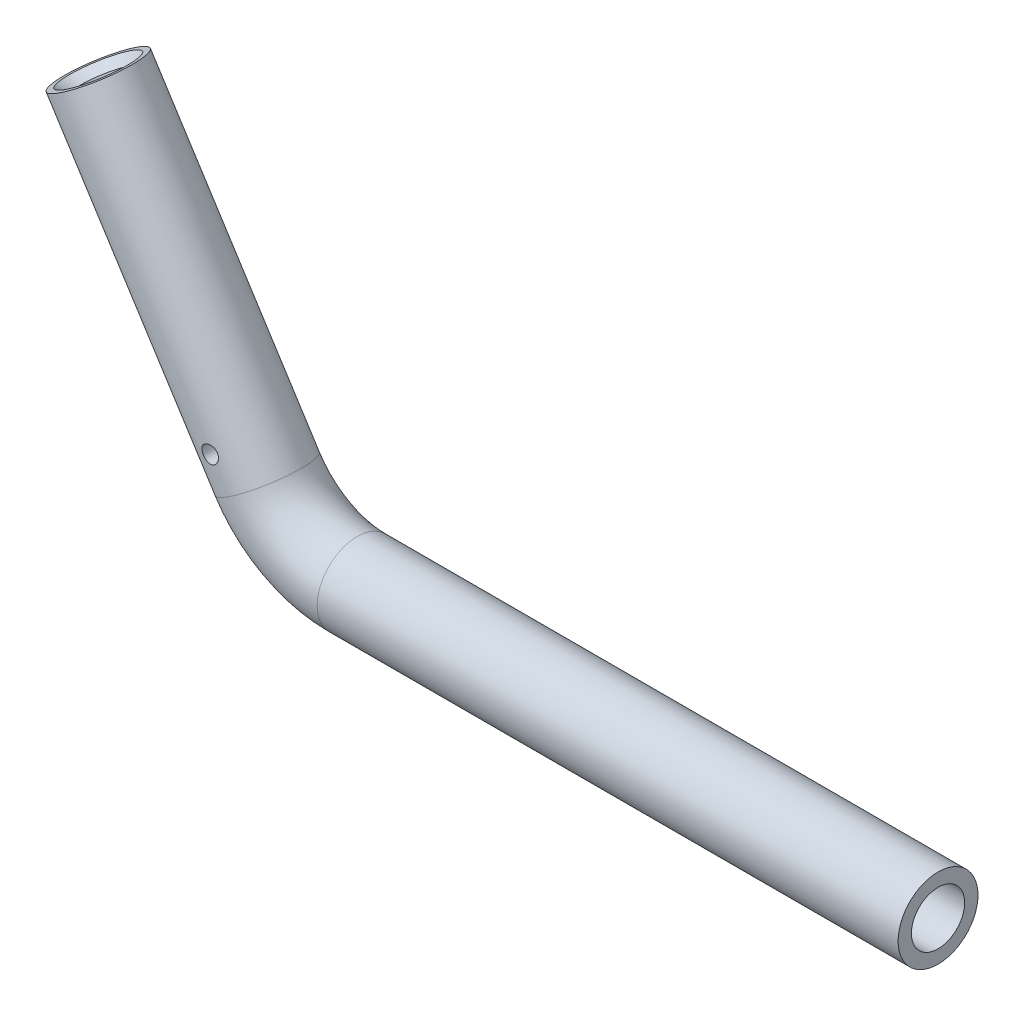
ISO-10303-21;
HEADER;
FILE_DESCRIPTION(('STEP AP214'),'2;1');
FILE_NAME('part.step','',(''),(''),'','','');
FILE_SCHEMA(('AUTOMOTIVE_DESIGN { 1 0 10303 214 1 1 1 1 }'));
ENDSEC;
DATA;
#1=APPLICATION_CONTEXT('core data for automotive mechanical design processes');
#2=APPLICATION_PROTOCOL_DEFINITION('international standard','automotive_design',2000,#1);
#3=PRODUCT_CONTEXT('',#1,'mechanical');
#4=PRODUCT('Part','Part','',(#3));
#5=PRODUCT_RELATED_PRODUCT_CATEGORY('part','',(#4));
#6=PRODUCT_DEFINITION_FORMATION('','',#4);
#7=PRODUCT_DEFINITION_CONTEXT('part definition',#1,'design');
#8=PRODUCT_DEFINITION('design','',#6,#7);
#9=PRODUCT_DEFINITION_SHAPE('','',#8);
#10=(LENGTH_UNIT() NAMED_UNIT(*) SI_UNIT(.MILLI.,.METRE.));
#11=(NAMED_UNIT(*) PLANE_ANGLE_UNIT() SI_UNIT($,.RADIAN.));
#12=(NAMED_UNIT(*) SI_UNIT($,.STERADIAN.) SOLID_ANGLE_UNIT());
#13=UNCERTAINTY_MEASURE_WITH_UNIT(LENGTH_MEASURE(1.E-05),#10,'distance_accuracy_value','');
#14=(GEOMETRIC_REPRESENTATION_CONTEXT(3) GLOBAL_UNCERTAINTY_ASSIGNED_CONTEXT((#13)) GLOBAL_UNIT_ASSIGNED_CONTEXT((#10,
#11,#12)) REPRESENTATION_CONTEXT('',''));
#15=CARTESIAN_POINT('',(0.,0.,0.));
#16=DIRECTION('',(0.,0.,1.));
#17=DIRECTION('',(1.,0.,0.));
#18=AXIS2_PLACEMENT_3D('',#15,#16,#17);
#19=CARTESIAN_POINT('',(304.8,0.,0.));
#20=DIRECTION('',(1.,0.,0.));
#21=DIRECTION('',(0.,1.,0.));
#22=AXIS2_PLACEMENT_3D('',#19,#20,#21);
#23=PLANE('',#22);
#24=CARTESIAN_POINT('',(304.8,0.,0.));
#25=DIRECTION('',(1.,0.,0.));
#26=DIRECTION('',(0.,1.,0.));
#27=AXIS2_PLACEMENT_3D('',#24,#25,#26);
#28=CIRCLE('',#27,12.7);
#29=CARTESIAN_POINT('',(304.8,12.7,0.));
#30=VERTEX_POINT('',#29);
#31=EDGE_CURVE('E163',#30,#30,#28,.T.);
#32=ORIENTED_EDGE('',*,*,#31,.F.);
#33=EDGE_LOOP('',(#32));
#34=FACE_BOUND('',#33,.T.);
#35=CARTESIAN_POINT('',(304.8,0.,0.));
#36=DIRECTION('',(1.,0.,0.));
#37=DIRECTION('',(0.,1.,0.));
#38=AXIS2_PLACEMENT_3D('',#35,#36,#37);
#39=CIRCLE('',#38,19.05);
#40=CARTESIAN_POINT('',(304.8,19.05,0.));
#41=VERTEX_POINT('',#40);
#42=EDGE_CURVE('E166',#41,#41,#39,.T.);
#43=ORIENTED_EDGE('',*,*,#42,.T.);
#44=EDGE_LOOP('',(#43));
#45=FACE_BOUND('',#44,.T.);
#46=ADVANCED_FACE('F63',(#34,#45),#23,.T.);
#47=CARTESIAN_POINT('',(-95.531870364066,149.954999065531,0.));
#48=DIRECTION('',(0.537299608346828,-0.843391445812883,0.));
#49=DIRECTION('',(0.843391445812883,0.537299608346828,0.));
#50=AXIS2_PLACEMENT_3D('',#47,#48,#49);
#51=PLANE('',#50);
#52=CARTESIAN_POINT('',(-95.5318703640661,149.954999065531,0.));
#53=DIRECTION('',(0.537299608346828,-0.843391445812883,0.));
#54=DIRECTION('',(0.843391445812883,0.537299608346828,0.));
#55=AXIS2_PLACEMENT_3D('',#52,#53,#54);
#56=CIRCLE('',#55,16.2560000000002);
#57=CARTESIAN_POINT('',(-81.8216990209317,158.689341498817,0.));
#58=VERTEX_POINT('',#57);
#59=EDGE_CURVE('E70',#58,#58,#56,.T.);
#60=ORIENTED_EDGE('',*,*,#59,.T.);
#61=EDGE_LOOP('',(#60));
#62=FACE_BOUND('',#61,.T.);
#63=CARTESIAN_POINT('',(-95.531870364066,149.954999065531,0.));
#64=DIRECTION('',(0.537299608346828,-0.843391445812883,0.));
#65=DIRECTION('',(0.843391445812883,0.537299608346828,0.));
#66=AXIS2_PLACEMENT_3D('',#63,#64,#65);
#67=CIRCLE('',#66,19.05);
#68=CARTESIAN_POINT('',(-79.4652633213306,160.190556604538,0.));
#69=VERTEX_POINT('',#68);
#70=EDGE_CURVE('E74',#69,#69,#67,.T.);
#71=ORIENTED_EDGE('',*,*,#70,.F.);
#72=EDGE_LOOP('',(#71));
#73=FACE_BOUND('',#72,.T.);
#74=ADVANCED_FACE('F126',(#62,#73),#51,.F.);
#75=CARTESIAN_POINT('',(304.8,0.,0.));
#76=DIRECTION('',(-1.,0.,0.));
#77=DIRECTION('',(0.,0.,1.));
#78=AXIS2_PLACEMENT_3D('',#75,#76,#77);
#79=CYLINDRICAL_SURFACE('',#78,19.05);
#80=CARTESIAN_POINT('',(27.8698343606345,0.,0.));
#81=DIRECTION('',(1.,0.,0.));
#82=DIRECTION('',(0.,1.,0.));
#83=AXIS2_PLACEMENT_3D('',#80,#81,#82);
#84=CIRCLE('',#83,19.05);
#85=CARTESIAN_POINT('',(27.8698343606344,-19.05,0.));
#86=VERTEX_POINT('',#85);
#87=EDGE_CURVE('E173',#86,#86,#84,.T.);
#88=ORIENTED_EDGE('',*,*,#87,.T.);
#89=EDGE_LOOP('',(#88));
#90=FACE_BOUND('',#89,.T.);
#91=ORIENTED_EDGE('',*,*,#42,.F.);
#92=EDGE_LOOP('',(#91));
#93=FACE_BOUND('',#92,.T.);
#94=ADVANCED_FACE('F129',(#90,#93),#79,.T.);
#95=CARTESIAN_POINT('',(27.8698343606345,50.8,0.));
#96=DIRECTION('',(0.,0.,-1.));
#97=DIRECTION('',(-1.,0.,0.));
#98=AXIS2_PLACEMENT_3D('',#95,#96,#97);
#99=TOROIDAL_SURFACE('',#98,50.8,19.05);
#100=CARTESIAN_POINT('',(-14.97445108666,23.5051798959812,0.));
#101=DIRECTION('',(0.537299608346828,-0.843391445812883,0.));
#102=DIRECTION('',(0.843391445812883,0.537299608346828,0.));
#103=AXIS2_PLACEMENT_3D('',#100,#101,#102);
#104=CIRCLE('',#103,19.05);
#105=CARTESIAN_POINT('',(-31.0410581293954,13.2696223569742,0.));
#106=VERTEX_POINT('',#105);
#107=EDGE_CURVE('E78',#106,#106,#104,.T.);
#108=CARTESIAN_POINT('',(27.8698343606345,50.8,0.));
#109=DIRECTION('',(0.,0.,-1.));
#110=DIRECTION('',(-1.,0.,0.));
#111=AXIS2_PLACEMENT_3D('',#108,#109,#110);
#112=CIRCLE('',#111,69.85);
#113=EDGE_CURVE('',#86,#106,#112,.T.);
#114=ORIENTED_EDGE('',*,*,#87,.F.);
#115=ORIENTED_EDGE('',*,*,#107,.T.);
#116=ORIENTED_EDGE('',*,*,#113,.T.);
#117=ORIENTED_EDGE('',*,*,#113,.F.);
#118=EDGE_LOOP('',(#114,#116,#115,#117));
#119=FACE_BOUND('',#118,.T.);
#120=ADVANCED_FACE('F123',(#119),#99,.T.);
#121=CARTESIAN_POINT('',(-14.9744510866599,23.5051798959812,0.));
#122=DIRECTION('',(-0.537299608346828,0.843391445812883,0.));
#123=DIRECTION('',(-0.843391445812883,-0.537299608346828,0.));
#124=AXIS2_PLACEMENT_3D('',#121,#122,#123);
#125=CYLINDRICAL_SURFACE('',#124,19.05);
#126=CARTESIAN_POINT('',(-25.5511938769672,40.1073405068078,-19.05));
#127=CARTESIAN_POINT('',(-25.7355975587145,39.9898530923024,-19.0499959544463));
#128=CARTESIAN_POINT('',(-25.910272199944,39.8569122362364,-19.0461970853922));
#129=CARTESIAN_POINT('',(-26.2350602713657,39.5640044896864,-19.0314092368756));
#130=CARTESIAN_POINT('',(-26.385154758251,39.4040169461743,-19.020414744226));
#131=CARTESIAN_POINT('',(-26.6564155078543,39.0618813262833,-18.9924621179241));
#132=CARTESIAN_POINT('',(-26.7776101628814,38.8797552675049,-18.9755098782465));
#133=CARTESIAN_POINT('',(-26.9880852639211,38.4983451358118,-18.9374800265717));
#134=CARTESIAN_POINT('',(-27.0773672343297,38.2990618830214,-18.9164026116992));
#135=CARTESIAN_POINT('',(-27.2227237265035,37.8860289922315,-18.8720987908286));
#136=CARTESIAN_POINT('',(-27.2783545045432,37.6721257666539,-18.8488481472792));
#137=CARTESIAN_POINT('',(-27.3531227952617,37.2379495708738,-18.8029927507296));
#138=CARTESIAN_POINT('',(-27.3722573239734,37.0176760813273,-18.7803880506913));
#139=CARTESIAN_POINT('',(-27.3734120770959,36.5745495555325,-18.738146499752));
#140=CARTESIAN_POINT('',(-27.3550679832257,36.3516923375718,-18.7185407919698));
#141=CARTESIAN_POINT('',(-27.2808450942139,35.911885556211,-18.6848626009175));
#142=CARTESIAN_POINT('',(-27.2249702758407,35.6949353694338,-18.6707895316576));
#143=CARTESIAN_POINT('',(-27.0781596006029,35.2762679841744,-18.6500158387062));
#144=CARTESIAN_POINT('',(-26.9877240424066,35.0743804233998,-18.6432150463383));
#145=CARTESIAN_POINT('',(-26.7742994198883,34.6885060696719,-18.637454656878));
#146=CARTESIAN_POINT('',(-26.6513139167872,34.5045173214571,-18.6384942023328));
#147=CARTESIAN_POINT('',(-26.3786597641631,34.1626266149161,-18.648206130812));
#148=CARTESIAN_POINT('',(-26.2294543395378,34.0043512022733,-18.6567549186825));
#149=CARTESIAN_POINT('',(-25.9073499683809,33.7146851235098,-18.6803272164343));
#150=CARTESIAN_POINT('',(-25.7344498217096,33.5832958200141,-18.6953510543602));
#151=CARTESIAN_POINT('',(-25.3684863011185,33.3500058994432,-18.7303054210753));
#152=CARTESIAN_POINT('',(-25.1752870879196,33.2483237503662,-18.7502704002761));
#153=CARTESIAN_POINT('',(-24.7750065380702,33.0782811657887,-18.7928357310368));
#154=CARTESIAN_POINT('',(-24.5679235047682,33.0099248112911,-18.8154364049383));
#155=CARTESIAN_POINT('',(-24.1412618929248,32.9072930893986,-18.8612602708487));
#156=CARTESIAN_POINT('',(-23.9215195497421,32.8736988078602,-18.8844870734141));
#157=CARTESIAN_POINT('',(-23.4792650060666,32.8439143218826,-18.9285486684433));
#158=CARTESIAN_POINT('',(-23.2567527653293,32.8477246615376,-18.9493834261076));
#159=CARTESIAN_POINT('',(-22.8147495274718,32.8928568417497,-18.9863700734819));
#160=CARTESIAN_POINT('',(-22.5952644826569,32.934244154732,-19.0025137247894));
#161=CARTESIAN_POINT('',(-22.166091948948,33.0536405332586,-19.02823717856));
#162=CARTESIAN_POINT('',(-21.9564031944702,33.1316448537826,-19.0378178310949));
#163=CARTESIAN_POINT('',(-21.5566722630239,33.3204027739596,-19.0492165164295));
#164=CARTESIAN_POINT('',(-21.3663466250096,33.4305481680033,-19.0511698039591));
#165=CARTESIAN_POINT('',(-21.0067135912579,33.6809005886261,-19.047470515074));
#166=CARTESIAN_POINT('',(-20.8374049307103,33.8211058048066,-19.0418183965985));
#167=CARTESIAN_POINT('',(-20.5261421364763,34.1259681510951,-19.0236282597313));
#168=CARTESIAN_POINT('',(-20.3839393970725,34.2903758117791,-19.0111573330754));
#169=CARTESIAN_POINT('',(-20.1286568416947,34.6399730265704,-18.9807235616682));
#170=CARTESIAN_POINT('',(-20.0155793166847,34.8251642138479,-18.9627602851363));
#171=CARTESIAN_POINT('',(-19.8201700919287,35.2137671401642,-18.9229984887722));
#172=CARTESIAN_POINT('',(-19.7382557864355,35.4173838869112,-18.9011532877639));
#173=CARTESIAN_POINT('',(-19.6093384436453,35.8352587722371,-18.8561553219306));
#174=CARTESIAN_POINT('',(-19.5623394250103,36.0495181327274,-18.8330024069209));
#175=CARTESIAN_POINT('',(-19.504034802161,36.486549049684,-18.7875386369463));
#176=CARTESIAN_POINT('',(-19.4933245479793,36.7094024716995,-18.7652477045544));
#177=CARTESIAN_POINT('',(-19.5096957980705,37.1540758935171,-18.7244665908556));
#178=CARTESIAN_POINT('',(-19.5367757401541,37.3758959356572,-18.7059762524741));
#179=CARTESIAN_POINT('',(-19.6279140644961,37.8109973027265,-18.6750534048471));
#180=CARTESIAN_POINT('',(-19.6917705945296,38.0243184954354,-18.662588505787));
#181=CARTESIAN_POINT('',(-19.8546320686855,38.4374096459997,-18.6450625577414));
#182=CARTESIAN_POINT('',(-19.9536320734938,38.6371815034781,-18.6400004688238));
#183=CARTESIAN_POINT('',(-20.1816657639534,39.0135098423385,-18.6379137543164));
#184=CARTESIAN_POINT('',(-20.3100792600826,39.1904416420766,-18.6407350431125));
#185=CARTESIAN_POINT('',(-20.5942108022789,39.5204955630327,-18.653751467759));
#186=CARTESIAN_POINT('',(-20.749928595161,39.6736179050043,-18.6639465352371));
#187=CARTESIAN_POINT('',(-21.0836987251584,39.951462725619,-18.6904907109553));
#188=CARTESIAN_POINT('',(-21.2616881252699,40.0762625491225,-18.7068227276071));
#189=CARTESIAN_POINT('',(-21.6354028029804,40.2947913905735,-18.74380922804));
#190=CARTESIAN_POINT('',(-21.8311296939555,40.3885175784893,-18.7644641052464));
#191=CARTESIAN_POINT('',(-22.2387624289159,40.5439550719853,-18.8082366456628));
#192=CARTESIAN_POINT('',(-22.4508970857334,40.6050558291774,-18.8313921366381));
#193=CARTESIAN_POINT('',(-22.8824783361525,40.6910314804549,-18.8772915129816));
#194=CARTESIAN_POINT('',(-23.1019266010527,40.7158980354644,-18.90003530241));
#195=CARTESIAN_POINT('',(-23.5446781529192,40.7287013301702,-18.942852741035));
#196=CARTESIAN_POINT('',(-23.7679969660848,40.7162171069179,-18.962893272653));
#197=CARTESIAN_POINT('',(-24.2095808621033,40.6535530771967,-18.9977182675982));
#198=CARTESIAN_POINT('',(-24.4278502300016,40.6034065391175,-19.0125073527343));
#199=CARTESIAN_POINT('',(-24.8003824848296,40.4837047858471,-19.0323705817646));
#200=CARTESIAN_POINT('',(-24.957136711088,40.4220047847735,-19.0389421513723));
#201=CARTESIAN_POINT('',(-25.2615793866343,40.2790342043443,-19.0477583396872));
#202=CARTESIAN_POINT('',(-25.409268161023,40.1977643273093,-19.0500031136477));
#203=CARTESIAN_POINT('',(-25.5511938769672,40.1073405068078,-19.05));
#204=B_SPLINE_CURVE_WITH_KNOTS('',3,(#126,#127,#128,#129,#130,#131,#132,#133,#134,#135,#136,
#137,#138,#139,#140,#141,#142,#143,#144,#145,#146,#147,#148,#149,#150,#151,#152,#153,#154,#155,
#156,#157,#158,#159,#160,#161,#162,#163,#164,#165,#166,#167,#168,#169,#170,#171,#172,#173,#174,
#175,#176,#177,#178,#179,#180,#181,#182,#183,#184,#185,#186,#187,#188,#189,#190,#191,#192,#193,
#194,#195,#196,#197,#198,#199,#200,#201,#202,#203),.UNSPECIFIED.,.T.,.F.,(4,2,2,2,2,2,2,2,2,2,2,
2,2,2,2,2,2,2,2,2,2,2,2,2,2,2,2,2,2,2,2,2,2,2,2,2,2,2,4),(0.,0.655335536359937,1.31117377047074,
1.96636500446924,2.62152493729894,3.2851458463419,3.94882101132033,4.61897824819391,
5.28906448617531,5.94979709615878,6.61045744664221,7.26044350565639,7.91046249870233,
8.56514791948917,9.21991349147671,9.88727788871545,10.5546519935681,11.2231911371325,
11.8916436718606,12.5481873363375,13.2046914705739,13.8548494096794,14.5050584740341,
15.1636930059187,15.8224033332485,16.49186939873,17.1613077903219,17.8271064465212,
18.4928115636614,19.145596568463,19.7983755204911,20.4493497781653,21.1003833070499,
21.7632074078816,22.426184029469,23.0966607893566,23.7665459901203,24.2709410315514,
24.7753179740306),.UNSPECIFIED.);
#205=CARTESIAN_POINT('',(-25.5511938769672,40.1073405068078,-19.05));
#206=VERTEX_POINT('',#205);
#207=EDGE_CURVE('E112',#206,#206,#204,.T.);
#208=ORIENTED_EDGE('',*,*,#207,.T.);
#209=EDGE_LOOP('',(#208));
#210=FACE_BOUND('',#209,.T.);
#211=CARTESIAN_POINT('',(-19.4988453189059,36.7869083846425,18.7583909363808));
#212=CARTESIAN_POINT('',(-19.4988524912497,36.5647947417792,18.7795162352231));
#213=CARTESIAN_POINT('',(-19.517693143737,36.3427290438337,18.8022794325507));
#214=CARTESIAN_POINT('',(-19.5924884010998,35.904870279129,18.8485011452872));
#215=CARTESIAN_POINT('',(-19.6484766197023,35.6890830783646,18.8719602720392));
#216=CARTESIAN_POINT('',(-19.7960875635054,35.2698400733021,18.9169293806671));
#217=CARTESIAN_POINT('',(-19.8877069895548,35.066383129341,18.9384395427734));
#218=CARTESIAN_POINT('',(-20.104156925015,34.6775693781306,18.9770975443687));
#219=CARTESIAN_POINT('',(-20.2289785114789,34.4922077261136,18.9942465534817));
#220=CARTESIAN_POINT('',(-20.5074336172014,34.1462026493908,19.0221478359174));
#221=CARTESIAN_POINT('',(-20.6608532110751,33.9853908563167,19.0329452784848));
#222=CARTESIAN_POINT('',(-20.9927346633451,33.6917082198072,19.0471111737107));
#223=CARTESIAN_POINT('',(-21.1711942987862,33.558834898719,19.0504802853836));
#224=CARTESIAN_POINT('',(-21.5444708932191,33.3271313690668,19.049417773132));
#225=CARTESIAN_POINT('',(-21.7389326648999,33.2277276724489,19.0451264590048));
#226=CARTESIAN_POINT('',(-22.1413436938651,33.0624556209417,19.0294889997561));
#227=CARTESIAN_POINT('',(-22.3492929286914,32.996587210214,19.0181428663813));
#228=CARTESIAN_POINT('',(-22.7727854044914,32.9000730032538,18.9896336562306));
#229=CARTESIAN_POINT('',(-22.9883279847031,32.869424150031,18.9724710844779));
#230=CARTESIAN_POINT('',(-23.4211705036665,32.8439693215057,18.9341716216409));
#231=CARTESIAN_POINT('',(-23.6384706369192,32.849167368975,18.9130342847637));
#232=CARTESIAN_POINT('',(-24.072982901896,32.8955568990625,18.8686356503494));
#233=CARTESIAN_POINT('',(-24.2901228465511,32.9373954740137,18.8453429359738));
#234=CARTESIAN_POINT('',(-24.7144490755891,33.0567977275953,18.7995354186805));
#235=CARTESIAN_POINT('',(-24.9216346450019,33.1343639681311,18.7770206716725));
#236=CARTESIAN_POINT('',(-25.3222327447425,33.3240958973705,18.7351000316267));
#237=CARTESIAN_POINT('',(-25.5155015463027,33.4365723556434,18.715724541622));
#238=CARTESIAN_POINT('',(-25.8805500001629,33.6928643525807,18.6826086796106));
#239=CARTESIAN_POINT('',(-26.0523320769868,33.8366763503679,18.6688676714197));
#240=CARTESIAN_POINT('',(-26.3669770311934,34.1493129617972,18.6488213236222));
#241=CARTESIAN_POINT('',(-26.5102210643766,34.3177471592658,18.6424116598492));
#242=CARTESIAN_POINT('',(-26.7665657894937,34.676264104855,18.6374416155691));
#243=CARTESIAN_POINT('',(-26.879669610332,34.8663446029115,18.6388804199667));
#244=CARTESIAN_POINT('',(-27.0709193363209,35.2594167057819,18.649347026004));
#245=CARTESIAN_POINT('',(-27.149588515454,35.4621573610418,18.6582547631807));
#246=CARTESIAN_POINT('',(-27.2724789376637,35.8774512828173,18.6824722132272));
#247=CARTESIAN_POINT('',(-27.3166983439746,36.0900050719021,18.6977822673837));
#248=CARTESIAN_POINT('',(-27.369876559814,36.5207629853844,18.7332196781868));
#249=CARTESIAN_POINT('',(-27.3785578540475,36.7389982371324,18.7533836518807));
#250=CARTESIAN_POINT('',(-27.3598381423156,37.1736736703431,18.7962284498619));
#251=CARTESIAN_POINT('',(-27.3324327193354,37.3901136287986,18.8189095819383));
#252=CARTESIAN_POINT('',(-27.2414495320436,37.8195935356151,18.8647649469213));
#253=CARTESIAN_POINT('',(-27.1771897509331,38.0324892111013,18.8879403117927));
#254=CARTESIAN_POINT('',(-27.0136816016735,38.4446824562619,18.9317711199822));
#255=CARTESIAN_POINT('',(-26.914432894269,38.6439798940643,18.9524265388641));
#256=CARTESIAN_POINT('',(-26.6834209889975,39.0235642765222,18.9889317713607));
#257=CARTESIAN_POINT('',(-26.5516222788588,39.2038301489218,19.0047762938799));
#258=CARTESIAN_POINT('',(-26.2592009711699,39.5397622265598,19.0298306004742));
#259=CARTESIAN_POINT('',(-26.0985821321695,39.6954316345504,19.0390412489153));
#260=CARTESIAN_POINT('',(-25.7562907994755,39.9749240020817,19.0496774414255));
#261=CARTESIAN_POINT('',(-25.5750492141681,40.0992696650656,19.0512401059306));
#262=CARTESIAN_POINT('',(-25.1945030838293,40.3160784005458,19.0467788096338));
#263=CARTESIAN_POINT('',(-24.9951995732671,40.4085432975089,19.0407552830648));
#264=CARTESIAN_POINT('',(-24.5861969447913,40.5583360203694,19.0218801149109));
#265=CARTESIAN_POINT('',(-24.3766093133685,40.6159768478376,19.0090912969732));
#266=CARTESIAN_POINT('',(-23.9512029922172,40.6960299999053,18.9781062132702));
#267=CARTESIAN_POINT('',(-23.7353837885996,40.7184394106331,18.9599095003841));
#268=CARTESIAN_POINT('',(-23.3004214693755,40.7276674196351,18.9197781387624));
#269=CARTESIAN_POINT('',(-23.081272556562,40.7140052137949,18.8977966813567));
#270=CARTESIAN_POINT('',(-22.6483821327105,40.6505515649212,18.8526510876994));
#271=CARTESIAN_POINT('',(-22.4346412395367,40.6007560127824,18.8294868172161));
#272=CARTESIAN_POINT('',(-22.0148971576465,40.465261137142,18.7841381787266));
#273=CARTESIAN_POINT('',(-21.8090728221792,40.3789993191033,18.7619754584479));
#274=CARTESIAN_POINT('',(-21.4146295813369,40.1727869144047,18.7215744179953));
#275=CARTESIAN_POINT('',(-21.226009512013,40.0528386090359,18.7033358322217));
#276=CARTESIAN_POINT('',(-20.8725306689314,39.7833189874754,18.6730226278341));
#277=CARTESIAN_POINT('',(-20.7075333421962,39.633933744421,18.6609109138841));
#278=CARTESIAN_POINT('',(-20.4048566459966,39.3092714469374,18.6441364049123));
#279=CARTESIAN_POINT('',(-20.2671775172173,39.1339941644121,18.6394736755167));
#280=CARTESIAN_POINT('',(-20.0256429440796,38.7662946376572,18.6381754308224));
#281=CARTESIAN_POINT('',(-19.9211927748852,38.5742629034416,18.6413885936904));
#282=CARTESIAN_POINT('',(-19.7455921377737,38.1759054785634,18.6551483506186));
#283=CARTESIAN_POINT('',(-19.6744169070513,37.9695905489796,18.6656894767217));
#284=CARTESIAN_POINT('',(-19.5802724533094,37.6002141924288,18.6895239034723));
#285=CARTESIAN_POINT('',(-19.5497649022926,37.4389403590091,18.7015101015598));
#286=CARTESIAN_POINT('',(-19.5090483988265,37.1140718564845,18.7281650419074));
#287=CARTESIAN_POINT('',(-19.4988400370547,36.9504771199842,18.7428338622145));
#288=CARTESIAN_POINT('',(-19.4988453189059,36.7869083846425,18.7583909363808));
#289=B_SPLINE_CURVE_WITH_KNOTS('',3,(#211,#212,#213,#214,#215,#216,#217,#218,#219,#220,#221,
#222,#223,#224,#225,#226,#227,#228,#229,#230,#231,#232,#233,#234,#235,#236,#237,#238,#239,#240,
#241,#242,#243,#244,#245,#246,#247,#248,#249,#250,#251,#252,#253,#254,#255,#256,#257,#258,#259,
#260,#261,#262,#263,#264,#265,#266,#267,#268,#269,#270,#271,#272,#273,#274,#275,#276,#277,#278,
#279,#280,#281,#282,#283,#284,#285,#286,#287,#288),.UNSPECIFIED.,.T.,.F.,(4,2,2,2,2,2,2,2,2,2,2,
2,2,2,2,2,2,2,2,2,2,2,2,2,2,2,2,2,2,2,2,2,2,2,2,2,2,2,4),(0.,0.668753214747219,1.3381123911693,
2.00740960528976,2.67652712989135,3.34082681774638,4.00506756899182,4.65726651108069,
5.30946436721605,5.96160560954886,6.61382003695643,7.27779062055069,7.94180882255515,
8.61191637348017,9.28194824231141,9.94232214633016,10.602627469131,11.2525173417381,
11.902441862288,12.5574320397666,13.2125023955094,13.8801055361377,14.5477151500781,
15.216056373395,15.8843104988926,16.540538488091,17.196728916554,17.8469301371349,
18.4971851308371,19.156151087026,19.8151919929577,20.4847925719731,21.1543478157246,
21.8197991855054,22.4852564179381,23.1380285921146,23.7903142048305,24.2827825346087,
24.7752651943041),.UNSPECIFIED.);
#290=CARTESIAN_POINT('',(-19.4988453189059,36.7869083846425,18.7583909363808));
#291=VERTEX_POINT('',#290);
#292=EDGE_CURVE('E89',#291,#291,#289,.T.);
#293=ORIENTED_EDGE('',*,*,#292,.T.);
#294=EDGE_LOOP('',(#293));
#295=FACE_BOUND('',#294,.T.);
#296=ORIENTED_EDGE('',*,*,#70,.T.);
#297=EDGE_LOOP('',(#296));
#298=FACE_BOUND('',#297,.T.);
#299=ORIENTED_EDGE('',*,*,#107,.F.);
#300=EDGE_LOOP('',(#299));
#301=FACE_BOUND('',#300,.T.);
#302=ADVANCED_FACE('F117',(#210,#295,#298,#301),#125,.T.);
#303=CARTESIAN_POINT('',(307.569301656394,0.,0.));
#304=DIRECTION('',(-1.,0.,0.));
#305=DIRECTION('',(0.,0.,1.));
#306=AXIS2_PLACEMENT_3D('',#303,#304,#305);
#307=CYLINDRICAL_SURFACE('',#306,12.7);
#308=CARTESIAN_POINT('',(27.8698343606346,0.,0.));
#309=DIRECTION('',(1.,0.,0.));
#310=DIRECTION('',(0.,1.,0.));
#311=AXIS2_PLACEMENT_3D('',#308,#309,#310);
#312=CIRCLE('',#311,12.7);
#313=CARTESIAN_POINT('',(27.8698343606346,-12.7,0.));
#314=VERTEX_POINT('',#313);
#315=EDGE_CURVE('E164',#314,#314,#312,.T.);
#316=ORIENTED_EDGE('',*,*,#315,.F.);
#317=EDGE_LOOP('',(#316));
#318=FACE_BOUND('',#317,.T.);
#319=ORIENTED_EDGE('',*,*,#31,.T.);
#320=EDGE_LOOP('',(#319));
#321=FACE_BOUND('',#320,.T.);
#322=ADVANCED_FACE('F122',(#318,#321),#307,.F.);
#323=CARTESIAN_POINT('',(27.8698343606345,50.8,0.));
#324=DIRECTION('',(0.,0.,-1.));
#325=DIRECTION('',(-1.,0.,0.));
#326=AXIS2_PLACEMENT_3D('',#323,#324,#325);
#327=TOROIDAL_SURFACE('',#326,50.8,12.7);
#328=CARTESIAN_POINT('',(-14.97445108666,23.5051798959811,0.));
#329=DIRECTION('',(0.537299608346828,-0.843391445812883,0.));
#330=DIRECTION('',(0.843391445812883,0.537299608346828,0.));
#331=AXIS2_PLACEMENT_3D('',#328,#329,#330);
#332=CIRCLE('',#331,12.7);
#333=CARTESIAN_POINT('',(-25.6855224484835,16.6814748699765,0.));
#334=VERTEX_POINT('',#333);
#335=EDGE_CURVE('E162',#334,#334,#332,.T.);
#336=CARTESIAN_POINT('',(27.8698343606345,50.8,0.));
#337=DIRECTION('',(0.,0.,-1.));
#338=DIRECTION('',(-1.,0.,0.));
#339=AXIS2_PLACEMENT_3D('',#336,#337,#338);
#340=CIRCLE('',#339,63.5);
#341=EDGE_CURVE('',#314,#334,#340,.T.);
#342=ORIENTED_EDGE('',*,*,#315,.T.);
#343=ORIENTED_EDGE('',*,*,#335,.F.);
#344=ORIENTED_EDGE('',*,*,#341,.T.);
#345=ORIENTED_EDGE('',*,*,#341,.F.);
#346=EDGE_LOOP('',(#342,#344,#343,#345));
#347=FACE_BOUND('',#346,.T.);
#348=ADVANCED_FACE('F138',(#347),#327,.F.);
#349=CARTESIAN_POINT('',(-14.97445108666,23.5051798959811,0.));
#350=DIRECTION('',(-0.537299608346828,0.843391445812883,0.));
#351=DIRECTION('',(-0.843391445812883,-0.537299608346828,0.));
#352=AXIS2_PLACEMENT_3D('',#349,#350,#351);
#353=CYLINDRICAL_SURFACE('',#352,12.7);
#354=CARTESIAN_POINT('',(-93.2548613697936,146.380810888254,0.));
#355=DIRECTION('',(0.537299608346828,-0.843391445812883,0.));
#356=DIRECTION('',(0.843391445812883,0.537299608346828,0.));
#357=AXIS2_PLACEMENT_3D('',#354,#355,#356);
#358=CIRCLE('',#357,12.7);
#359=CARTESIAN_POINT('',(-82.54379000797,153.204515914259,0.));
#360=VERTEX_POINT('',#359);
#361=EDGE_CURVE('E11',#360,#360,#358,.F.);
#362=ORIENTED_EDGE('',*,*,#361,.T.);
#363=EDGE_LOOP('',(#362));
#364=FACE_BOUND('',#363,.T.);
#365=CARTESIAN_POINT('',(-19.4988453189059,36.7869083846425,-12.2582515279339));
#366=CARTESIAN_POINT('',(-19.498845943672,37.0012840919449,-12.2270531256819));
#367=CARTESIAN_POINT('',(-19.5163837784509,37.2159899208355,-12.1980783138101));
#368=CARTESIAN_POINT('',(-19.5864870881644,37.6405253238588,-12.1478218959043));
#369=CARTESIAN_POINT('',(-19.6390426797949,37.8503562565796,-12.126538121789));
#370=CARTESIAN_POINT('',(-19.7782835169002,38.2596637522623,-12.0941737258467));
#371=CARTESIAN_POINT('',(-19.8650282685523,38.4591215719922,-12.0831110066229));
#372=CARTESIAN_POINT('',(-20.0703375473606,38.8412584891866,-12.0726564568477));
#373=CARTESIAN_POINT('',(-20.1888983547547,39.023939544751,-12.0732632625439));
#374=CARTESIAN_POINT('',(-20.4507891384037,39.3625732741974,-12.085895536992));
#375=CARTESIAN_POINT('',(-20.5933997827337,39.5190947066476,-12.0976254930768));
#376=CARTESIAN_POINT('',(-20.9012139296983,39.8068451265233,-12.1306702337221));
#377=CARTESIAN_POINT('',(-21.0664200714065,39.9380711552161,-12.1519861385535));
#378=CARTESIAN_POINT('',(-21.4172978235524,40.1737560306192,-12.2021360337515));
#379=CARTESIAN_POINT('',(-21.6032244668377,40.2778126917388,-12.2310714913745));
#380=CARTESIAN_POINT('',(-21.9888163178011,40.4544796731567,-12.2931578016608));
#381=CARTESIAN_POINT('',(-22.1884849899781,40.5270820296161,-12.3263097191341));
#382=CARTESIAN_POINT('',(-22.6059392781646,40.6417942755968,-12.3949123107884));
#383=CARTESIAN_POINT('',(-22.8241357907733,40.6823923004982,-12.4303994304792));
#384=CARTESIAN_POINT('',(-23.2647387913319,40.7264148978285,-12.4983693406557));
#385=CARTESIAN_POINT('',(-23.4871456000472,40.729836626436,-12.5308519011175));
#386=CARTESIAN_POINT('',(-23.9320656711551,40.6989212684826,-12.5895045256145));
#387=CARTESIAN_POINT('',(-24.1545651316184,40.6642773323641,-12.6156211864143));
#388=CARTESIAN_POINT('',(-24.5912511475397,40.5572534157393,-12.658213649174));
#389=CARTESIAN_POINT('',(-24.8054401577455,40.4848846710091,-12.6746923185678));
#390=CARTESIAN_POINT('',(-25.2109235514299,40.3077255955259,-12.6956812537946));
#391=CARTESIAN_POINT('',(-25.4027777676138,40.2042667975851,-12.7006211136195));
#392=CARTESIAN_POINT('',(-25.7667531551539,39.9671589999267,-12.6992533142483));
#393=CARTESIAN_POINT('',(-25.9388772136501,39.8335144258572,-12.6929473029171));
#394=CARTESIAN_POINT('',(-26.2543982559076,39.5438046215666,-12.6700816203319));
#395=CARTESIAN_POINT('',(-26.3984018718297,39.3883777123048,-12.6537801517306));
#396=CARTESIAN_POINT('',(-26.6592425628825,39.0571791595104,-12.6128400856651));
#397=CARTESIAN_POINT('',(-26.7760763514785,38.881405058575,-12.5882004804819));
#398=CARTESIAN_POINT('',(-26.9823437193516,38.509853109291,-12.5323932381816));
#399=CARTESIAN_POINT('',(-27.0710613178236,38.3136995586179,-12.5010845684749));
#400=CARTESIAN_POINT('',(-27.2153435537722,37.9100018957139,-12.4355102423211));
#401=CARTESIAN_POINT('',(-27.2708993277526,37.7024547543743,-12.4012437981183));
#402=CARTESIAN_POINT('',(-27.3490891417692,37.2727277418345,-12.3319268171958));
#403=CARTESIAN_POINT('',(-27.3703505868393,37.0502930491123,-12.2968980307566));
#404=CARTESIAN_POINT('',(-27.374925388575,36.6043317131218,-12.2314186430212));
#405=CARTESIAN_POINT('',(-27.3582392231339,36.3808050836401,-12.2009679840757));
#406=CARTESIAN_POINT('',(-27.2870520673084,35.9396124482603,-12.1484122252274));
#407=CARTESIAN_POINT('',(-27.2326848336034,35.7219285326569,-12.1262780315642));
#408=CARTESIAN_POINT('',(-27.0874126574941,35.2982415543121,-12.0930602208075));
#409=CARTESIAN_POINT('',(-26.9965213899788,35.0922341526936,-12.0819724732365));
#410=CARTESIAN_POINT('',(-26.7856300352502,34.7072607456126,-12.0725440916912));
#411=CARTESIAN_POINT('',(-26.6671023503248,34.5275000308366,-12.0736590934969));
#412=CARTESIAN_POINT('',(-26.4026169036183,34.1899480051193,-12.087183198961));
#413=CARTESIAN_POINT('',(-26.2566604732558,34.0321556284598,-12.0995917545312));
#414=CARTESIAN_POINT('',(-25.9440655864897,33.7450011773306,-12.1339187138184));
#415=CARTESIAN_POINT('',(-25.777763798428,33.6152542247131,-12.1556942054181));
#416=CARTESIAN_POINT('',(-25.4273768131751,33.3842878824022,-12.2062613234856));
#417=CARTESIAN_POINT('',(-25.2432879811194,33.2830743402688,-12.2350543858644));
#418=CARTESIAN_POINT('',(-24.8546360385882,33.1080299733645,-12.2977884386283));
#419=CARTESIAN_POINT('',(-24.6495588088383,33.0353963343322,-12.3318843549281));
#420=CARTESIAN_POINT('',(-24.2303250092665,32.9248118189083,-12.4006806029911));
#421=CARTESIAN_POINT('',(-24.0161664113204,32.8868687330308,-12.4353810687369));
#422=CARTESIAN_POINT('',(-23.5770402315969,32.8460719144872,-12.5028212798321));
#423=CARTESIAN_POINT('',(-23.3519467828042,32.8443890814892,-12.5354617231248));
#424=CARTESIAN_POINT('',(-22.9038699844305,32.8795502758129,-12.5938534034202));
#425=CARTESIAN_POINT('',(-22.6808863050821,32.9163881783123,-12.6196057348197));
#426=CARTESIAN_POINT('',(-22.2481740741167,33.0268266458387,-12.6608399142652));
#427=CARTESIAN_POINT('',(-22.0382662953308,33.0996466852733,-12.6765242287785));
#428=CARTESIAN_POINT('',(-21.633266761215,33.2798064935556,-12.6966737756836));
#429=CARTESIAN_POINT('',(-21.4381709570189,33.3871367866945,-12.7011420847658));
#430=CARTESIAN_POINT('',(-21.0761515273702,33.6282279979919,-12.6984098113035));
#431=CARTESIAN_POINT('',(-20.9084242051352,33.7607902336716,-12.6916590273997));
#432=CARTESIAN_POINT('',(-20.596976220836,34.0508389855117,-12.668062860778));
#433=CARTESIAN_POINT('',(-20.4532555145065,34.2083254557139,-12.6512174966736));
#434=CARTESIAN_POINT('',(-20.1934038558332,34.5437839633005,-12.6091743608821));
#435=CARTESIAN_POINT('',(-20.0772949899566,34.7217722321115,-12.5839699411887));
#436=CARTESIAN_POINT('',(-19.8754197958751,35.0933680182864,-12.5277631537052));
#437=CARTESIAN_POINT('',(-19.789661944692,35.2869798807989,-12.4967591697899));
#438=CARTESIAN_POINT('',(-19.6469522850612,35.6946143757128,-12.4304620569131));
#439=CARTESIAN_POINT('',(-19.5915860001239,35.9091708977841,-12.3950342968691));
#440=CARTESIAN_POINT('',(-19.5175315724692,36.3446703386806,-12.3250316997893));
#441=CARTESIAN_POINT('',(-19.4988446739748,36.5656134738918,-12.2904568917262));
#442=CARTESIAN_POINT('',(-19.4988453189059,36.7869083846425,-12.2582515279339));
#443=B_SPLINE_CURVE_WITH_KNOTS('',3,(#365,#366,#367,#368,#369,#370,#371,#372,#373,#374,#375,
#376,#377,#378,#379,#380,#381,#382,#383,#384,#385,#386,#387,#388,#389,#390,#391,#392,#393,#394,
#395,#396,#397,#398,#399,#400,#401,#402,#403,#404,#405,#406,#407,#408,#409,#410,#411,#412,#413,
#414,#415,#416,#417,#418,#419,#420,#421,#422,#423,#424,#425,#426,#427,#428,#429,#430,#431,#432,
#433,#434,#435,#436,#437,#438,#439,#440,#441,#442),.UNSPECIFIED.,.T.,.F.,(4,2,2,2,2,2,2,2,2,2,2,
2,2,2,2,2,2,2,2,2,2,2,2,2,2,2,2,2,2,2,2,2,2,2,2,2,2,2,4),(0.,0.649161332576675,1.29813952541778,
1.94825228749548,2.59828907497301,3.23152611607586,3.86483718026425,4.50705047244332,
5.1494262701564,5.82058200143004,6.49178907276912,7.16844674257541,7.84490299495322,
8.49574290806568,9.14648746100733,9.78109148976417,10.4157722420332,11.065513645375,
11.7154286340019,12.3907626397755,13.0660881407769,13.7390286314327,14.4117174022166,
15.0545244757942,15.6973003549281,16.3305990504617,16.9640274383278,17.6217153858372,
18.2795509951466,18.9585983827419,19.6375378177716,20.3023566482395,20.9669930906602,
21.6056201604033,22.2442460525834,22.883381070567,23.5226944580003,24.1927854313153,
24.8628991347894),.UNSPECIFIED.);
#444=CARTESIAN_POINT('',(-19.4988453189059,36.7869083846425,-12.2582515279339));
#445=VERTEX_POINT('',#444);
#446=EDGE_CURVE('E81',#445,#445,#443,.T.);
#447=ORIENTED_EDGE('',*,*,#446,.F.);
#448=EDGE_LOOP('',(#447));
#449=FACE_BOUND('',#448,.T.);
#450=CARTESIAN_POINT('',(-19.4988453189059,36.7869083846425,12.2582515279339));
#451=CARTESIAN_POINT('',(-19.4988483554021,36.5635588866373,12.290757027201));
#452=CARTESIAN_POINT('',(-19.5178876889888,36.3405183226941,12.3256820872288));
#453=CARTESIAN_POINT('',(-19.5933497397711,35.9009163592211,12.3963787801073));
#454=CARTESIAN_POINT('',(-19.649791151101,35.6843582563256,12.4321508276695));
#455=CARTESIAN_POINT('',(-19.798733819022,35.2633420904487,12.5005817893801));
#456=CARTESIAN_POINT('',(-19.891251806437,35.0588896923387,12.5332392503538));
#457=CARTESIAN_POINT('',(-20.1101630511088,34.6679559670671,12.5917845135457));
#458=CARTESIAN_POINT('',(-20.2365460186456,34.4814692044899,12.617674367358));
#459=CARTESIAN_POINT('',(-20.517474615991,34.1351300859761,12.6593824572902));
#460=CARTESIAN_POINT('',(-20.6714958902156,33.9748731926055,12.6753669909934));
#461=CARTESIAN_POINT('',(-21.0047311043696,33.6822693802817,12.6961389440352));
#462=CARTESIAN_POINT('',(-21.1839389428526,33.5499157211251,12.7009290702799));
#463=CARTESIAN_POINT('',(-21.5545697144001,33.3219045439779,12.6988116156775));
#464=CARTESIAN_POINT('',(-21.7452356048045,33.2250090818925,12.6923564445375));
#465=CARTESIAN_POINT('',(-22.1391789720818,33.0634760040668,12.6693090929296));
#466=CARTESIAN_POINT('',(-22.3424564555762,32.9988384052632,12.6527169071392));
#467=CARTESIAN_POINT('',(-22.7559335968744,32.9032588020309,12.6111285993928));
#468=CARTESIAN_POINT('',(-22.9661340020141,32.8723204478312,12.5861315674257));
#469=CARTESIAN_POINT('',(-23.3880010966176,32.8445241136577,12.5302659743167));
#470=CARTESIAN_POINT('',(-23.5996680945961,32.8476735362614,12.4993961392537));
#471=CARTESIAN_POINT('',(-24.0275554142995,32.8884705230862,12.4335775175828));
#472=CARTESIAN_POINT('',(-24.2436308671819,32.9274601643297,12.3985165346948));
#473=CARTESIAN_POINT('',(-24.6664632752456,33.0407805480222,12.329089188755));
#474=CARTESIAN_POINT('',(-24.8732183411196,33.1151184208497,12.294722967308));
#475=CARTESIAN_POINT('',(-25.2766690084956,33.2995554915567,12.2297402911119));
#476=CARTESIAN_POINT('',(-25.4730276007007,33.4104316927796,12.1992272434396));
#477=CARTESIAN_POINT('',(-25.8446870952619,33.6647124356154,12.1466362646225));
#478=CARTESIAN_POINT('',(-26.0199938432947,33.8081079151797,12.1245559881352));
#479=CARTESIAN_POINT('',(-26.3389670309669,34.1186042627014,12.0922184748863));
#480=CARTESIAN_POINT('',(-26.4834432900919,34.2848364720213,12.0816172306141));
#481=CARTESIAN_POINT('',(-26.7427714200943,34.6392598942393,12.072418201834));
#482=CARTESIAN_POINT('',(-26.8576306552759,34.8274456314337,12.0738174304255));
#483=CARTESIAN_POINT('',(-27.0504903267274,35.2124510234361,12.0881437935058));
#484=CARTESIAN_POINT('',(-27.1297248114149,35.4086714435553,12.100631148648));
#485=CARTESIAN_POINT('',(-27.2556508220175,35.8104874334408,12.135035799602));
#486=CARTESIAN_POINT('',(-27.3023387402596,36.0160840398342,12.1569541403701));
#487=CARTESIAN_POINT('',(-27.3628293398276,36.4345244243414,12.2081549959088));
#488=CARTESIAN_POINT('',(-27.3760956245848,36.6474314905437,12.2375493930803));
#489=CARTESIAN_POINT('',(-27.3682478643074,37.0720324507134,12.3003210619509));
#490=CARTESIAN_POINT('',(-27.347124958306,37.2837260178967,12.3336993581165));
#491=CARTESIAN_POINT('',(-27.2694487986253,37.7102138878939,12.402496997933));
#492=CARTESIAN_POINT('',(-27.2113579939927,37.9247256854405,12.4379409949824));
#493=CARTESIAN_POINT('',(-27.0597401221974,38.341421852707,12.5055447386987));
#494=CARTESIAN_POINT('',(-26.9662109159315,38.5436054774286,12.5377042869637));
#495=CARTESIAN_POINT('',(-26.7452035054259,38.9312439932312,12.5953902701334));
#496=CARTESIAN_POINT('',(-26.6175235585791,39.116590406753,12.6208754458171));
#497=CARTESIAN_POINT('',(-26.3318101738376,39.4634355507731,12.6620419885769));
#498=CARTESIAN_POINT('',(-26.1737859128792,39.6249414652263,12.6777263136083));
#499=CARTESIAN_POINT('',(-25.8386375443536,39.9131704815058,12.6970806669661));
#500=CARTESIAN_POINT('',(-25.6624858597175,40.0409953622061,12.7011909811394));
#501=CARTESIAN_POINT('',(-25.2916261133456,40.2658528228048,12.6982090758822));
#502=CARTESIAN_POINT('',(-25.0969205691615,40.3628895725947,12.6911183742763));
#503=CARTESIAN_POINT('',(-24.699500865771,40.5215940653339,12.6668103634917));
#504=CARTESIAN_POINT('',(-24.4970781684694,40.5840317033196,12.6498323377025));
#505=CARTESIAN_POINT('',(-24.0856763723623,40.6756250541649,12.6076953754129));
#506=CARTESIAN_POINT('',(-23.8766964311983,40.7047764728665,12.5825353839187));
#507=CARTESIAN_POINT('',(-23.4522474131532,40.7297542474003,12.5258383439704));
#508=CARTESIAN_POINT('',(-23.2367476245744,40.7247214064231,12.4941564401919));
#509=CARTESIAN_POINT('',(-22.8098243288647,40.6797438142513,12.4280751159704));
#510=CARTESIAN_POINT('',(-22.5984019264664,40.6397897335848,12.3936749715632));
#511=CARTESIAN_POINT('',(-22.1767478622864,40.5237872174827,12.3243795000765));
#512=CARTESIAN_POINT('',(-21.9668751991794,40.4464087979494,12.2895160702574));
#513=CARTESIAN_POINT('',(-21.5626128053506,40.2568930550515,12.2246584581203));
#514=CARTESIAN_POINT('',(-21.3682224857873,40.1447570544194,12.1946640905717));
#515=CARTESIAN_POINT('',(-21.0015712041313,39.8891527231396,12.1433331885572));
#516=CARTESIAN_POINT('',(-20.8291911946367,39.745865362876,12.12194860219));
#517=CARTESIAN_POINT('',(-20.5107658382513,39.431503793124,12.090360308208));
#518=CARTESIAN_POINT('',(-20.3647118814339,39.260438703252,12.0801529395252));
#519=CARTESIAN_POINT('',(-20.1095685436287,38.9039244919639,12.072458637638));
#520=CARTESIAN_POINT('',(-19.9991211049642,38.7194571274818,12.0744246957093));
#521=CARTESIAN_POINT('',(-19.8098516407602,38.335435910273,12.0895528014928));
#522=CARTESIAN_POINT('',(-19.731021242111,38.1358860684832,12.102711882083));
#523=CARTESIAN_POINT('',(-19.612461104706,37.7458112561891,12.1369937585927));
#524=CARTESIAN_POINT('',(-19.5698650582061,37.5560751357277,12.1572991169203));
#525=CARTESIAN_POINT('',(-19.5130529536318,37.1731190554663,12.2038838488366));
#526=CARTESIAN_POINT('',(-19.4988426951551,36.9798983918627,12.2301644420246));
#527=CARTESIAN_POINT('',(-19.4988453189059,36.7869083846425,12.2582515279339));
#528=B_SPLINE_CURVE_WITH_KNOTS('',3,(#450,#451,#452,#453,#454,#455,#456,#457,#458,#459,#460,
#461,#462,#463,#464,#465,#466,#467,#468,#469,#470,#471,#472,#473,#474,#475,#476,#477,#478,#479,
#480,#481,#482,#483,#484,#485,#486,#487,#488,#489,#490,#491,#492,#493,#494,#495,#496,#497,#498,
#499,#500,#501,#502,#503,#504,#505,#506,#507,#508,#509,#510,#511,#512,#513,#514,#515,#516,#517,
#518,#519,#520,#521,#522,#523,#524,#525,#526,#527),.UNSPECIFIED.,.T.,.F.,(4,2,2,2,2,2,2,2,2,2,2,
2,2,2,2,2,2,2,2,2,2,2,2,2,2,2,2,2,2,2,2,2,2,2,2,2,2,2,4),(0.,0.676403074470491,1.35314448086261,
2.03020010590543,2.70705024349978,3.37220509675704,4.03719909307239,4.6760536492175,
5.31490854078807,5.95383262485687,6.59289546188858,7.25690861207685,7.92105576259993,
8.60035139612166,9.27945796449412,9.93759584969104,10.5955699300593,11.2285580503374,
11.8616163239828,12.5047718681942,13.148093158728,13.82009457954,14.4921365696046,
15.1682397974201,15.8441388745613,16.493954315185,17.1436817083174,17.7783025172685,
18.4130051875543,19.0637186528317,19.7146060142643,20.390544129115,21.0664565236612,
21.7385424858752,22.4104082421928,23.0523098444143,23.694041340039,24.2783827989966,
24.8628436345559),.UNSPECIFIED.);
#529=CARTESIAN_POINT('',(-19.4988453189059,36.7869083846425,12.2582515279339));
#530=VERTEX_POINT('',#529);
#531=EDGE_CURVE('E90',#530,#530,#528,.T.);
#532=ORIENTED_EDGE('',*,*,#531,.F.);
#533=EDGE_LOOP('',(#532));
#534=FACE_BOUND('',#533,.T.);
#535=ORIENTED_EDGE('',*,*,#335,.T.);
#536=EDGE_LOOP('',(#535));
#537=FACE_BOUND('',#536,.T.);
#538=ADVANCED_FACE('F94',(#364,#449,#534,#537),#353,.F.);
#539=CARTESIAN_POINT('',(-23.4358453189059,36.7869083846425,-19.05));
#540=DIRECTION('',(0.,0.,1.));
#541=DIRECTION('',(1.,0.,0.));
#542=AXIS2_PLACEMENT_3D('',#539,#540,#541);
#543=CYLINDRICAL_SURFACE('',#542,3.937);
#544=ORIENTED_EDGE('',*,*,#531,.T.);
#545=EDGE_LOOP('',(#544));
#546=FACE_BOUND('',#545,.T.);
#547=ORIENTED_EDGE('',*,*,#292,.F.);
#548=EDGE_LOOP('',(#547));
#549=FACE_BOUND('',#548,.T.);
#550=ADVANCED_FACE('F100',(#546,#549),#543,.F.);
#551=ORIENTED_EDGE('',*,*,#446,.T.);
#552=EDGE_LOOP('',(#551));
#553=FACE_BOUND('',#552,.T.);
#554=ORIENTED_EDGE('',*,*,#207,.F.);
#555=EDGE_LOOP('',(#554));
#556=FACE_BOUND('',#555,.T.);
#557=ADVANCED_FACE('F97',(#553,#556),#543,.F.);
#558=CARTESIAN_POINT('',(-95.5318703640661,149.954999065531,0.));
#559=DIRECTION('',(-0.537299608346828,0.843391445812883,0.));
#560=DIRECTION('',(-0.843391445812883,-0.537299608346828,0.));
#561=AXIS2_PLACEMENT_3D('',#558,#559,#560);
#562=CONICAL_SURFACE('',#561,16.2560000000002,0.698131700797731);
#563=ORIENTED_EDGE('',*,*,#361,.F.);
#564=EDGE_LOOP('',(#563));
#565=FACE_BOUND('',#564,.T.);
#566=ORIENTED_EDGE('',*,*,#59,.F.);
#567=EDGE_LOOP('',(#566));
#568=FACE_BOUND('',#567,.T.);
#569=ADVANCED_FACE('F65',(#565,#568),#562,.F.);
#570=CLOSED_SHELL('',(#46,#74,#94,#120,#302,#322,#348,#538,#550,#557,#569));
#571=MANIFOLD_SOLID_BREP('B2',#570);
#572=ADVANCED_BREP_SHAPE_REPRESENTATION('',(#18,#571),#14);
#573=SHAPE_DEFINITION_REPRESENTATION(#9,#572);
ENDSEC;
END-ISO-10303-21;
